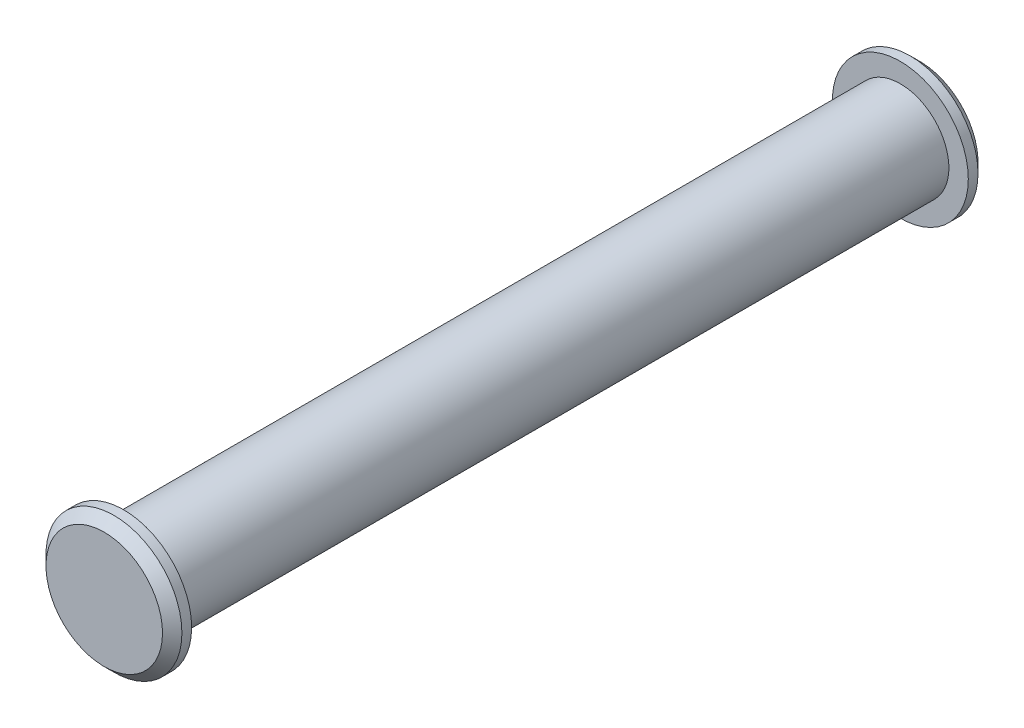
ISO-10303-21;
HEADER;
FILE_DESCRIPTION(('STEP AP214'),'2;1');
FILE_NAME('part.step','',(''),(''),'','','');
FILE_SCHEMA(('AUTOMOTIVE_DESIGN { 1 0 10303 214 1 1 1 1 }'));
ENDSEC;
DATA;
#1=APPLICATION_CONTEXT('core data for automotive mechanical design processes');
#2=APPLICATION_PROTOCOL_DEFINITION('international standard','automotive_design',2000,#1);
#3=PRODUCT_CONTEXT('',#1,'mechanical');
#4=PRODUCT('Part','Part','',(#3));
#5=PRODUCT_RELATED_PRODUCT_CATEGORY('part','',(#4));
#6=PRODUCT_DEFINITION_FORMATION('','',#4);
#7=PRODUCT_DEFINITION_CONTEXT('part definition',#1,'design');
#8=PRODUCT_DEFINITION('design','',#6,#7);
#9=PRODUCT_DEFINITION_SHAPE('','',#8);
#10=(LENGTH_UNIT() NAMED_UNIT(*) SI_UNIT(.MILLI.,.METRE.));
#11=(NAMED_UNIT(*) PLANE_ANGLE_UNIT() SI_UNIT($,.RADIAN.));
#12=(NAMED_UNIT(*) SI_UNIT($,.STERADIAN.) SOLID_ANGLE_UNIT());
#13=UNCERTAINTY_MEASURE_WITH_UNIT(LENGTH_MEASURE(1.E-05),#10,'distance_accuracy_value','');
#14=(GEOMETRIC_REPRESENTATION_CONTEXT(3) GLOBAL_UNCERTAINTY_ASSIGNED_CONTEXT((#13)) GLOBAL_UNIT_ASSIGNED_CONTEXT((#10,
#11,#12)) REPRESENTATION_CONTEXT('',''));
#15=CARTESIAN_POINT('',(0.,0.,0.));
#16=DIRECTION('',(0.,0.,1.));
#17=DIRECTION('',(1.,0.,0.));
#18=AXIS2_PLACEMENT_3D('',#15,#16,#17);
#19=CARTESIAN_POINT('',(0.,0.,20.));
#20=DIRECTION('',(0.,0.,-1.));
#21=DIRECTION('',(-1.,0.,0.));
#22=AXIS2_PLACEMENT_3D('',#19,#20,#21);
#23=CYLINDRICAL_SURFACE('',#22,2.5);
#24=CARTESIAN_POINT('',(0.,0.,20.));
#25=DIRECTION('',(0.,0.,1.));
#26=DIRECTION('',(1.,0.,0.));
#27=AXIS2_PLACEMENT_3D('',#24,#25,#26);
#28=CIRCLE('',#27,2.5);
#29=CARTESIAN_POINT('',(2.5,0.,20.));
#30=VERTEX_POINT('',#29);
#31=EDGE_CURVE('E53',#30,#30,#28,.T.);
#32=ORIENTED_EDGE('',*,*,#31,.F.);
#33=EDGE_LOOP('',(#32));
#34=FACE_BOUND('',#33,.T.);
#35=CARTESIAN_POINT('',(0.,0.,-20.));
#36=DIRECTION('',(0.,0.,-1.));
#37=DIRECTION('',(-1.,0.,0.));
#38=AXIS2_PLACEMENT_3D('',#35,#36,#37);
#39=CIRCLE('',#38,2.5);
#40=CARTESIAN_POINT('',(-2.5,0.,-20.));
#41=VERTEX_POINT('',#40);
#42=EDGE_CURVE('E59',#41,#41,#39,.T.);
#43=ORIENTED_EDGE('',*,*,#42,.F.);
#44=EDGE_LOOP('',(#43));
#45=FACE_BOUND('',#44,.T.);
#46=ADVANCED_FACE('F33',(#34,#45),#23,.T.);
#47=CARTESIAN_POINT('',(0.,0.,20.));
#48=DIRECTION('',(0.,0.,1.));
#49=DIRECTION('',(1.,0.,0.));
#50=AXIS2_PLACEMENT_3D('',#47,#48,#49);
#51=PLANE('',#50);
#52=CARTESIAN_POINT('',(0.,0.,20.));
#53=DIRECTION('',(0.,0.,1.));
#54=DIRECTION('',(1.,0.,0.));
#55=AXIS2_PLACEMENT_3D('',#52,#53,#54);
#56=CIRCLE('',#55,3.5);
#57=CARTESIAN_POINT('',(3.5,0.,20.));
#58=VERTEX_POINT('',#57);
#59=EDGE_CURVE('E56',#58,#58,#56,.T.);
#60=ORIENTED_EDGE('',*,*,#59,.F.);
#61=EDGE_LOOP('',(#60));
#62=FACE_BOUND('',#61,.T.);
#63=ORIENTED_EDGE('',*,*,#31,.T.);
#64=EDGE_LOOP('',(#63));
#65=FACE_BOUND('',#64,.T.);
#66=ADVANCED_FACE('F85',(#62,#65),#51,.F.);
#67=CARTESIAN_POINT('',(0.,0.,21.));
#68=DIRECTION('',(0.,0.,-1.));
#69=DIRECTION('',(-1.,0.,0.));
#70=AXIS2_PLACEMENT_3D('',#67,#68,#69);
#71=CYLINDRICAL_SURFACE('',#70,3.5);
#72=CARTESIAN_POINT('',(0.,0.,20.5));
#73=DIRECTION('',(0.,0.,1.));
#74=DIRECTION('',(1.,0.,0.));
#75=AXIS2_PLACEMENT_3D('',#72,#73,#74);
#76=CIRCLE('',#75,3.5);
#77=CARTESIAN_POINT('',(3.5,0.,20.5));
#78=VERTEX_POINT('',#77);
#79=EDGE_CURVE('E10',#78,#78,#76,.F.);
#80=ORIENTED_EDGE('',*,*,#79,.T.);
#81=EDGE_LOOP('',(#80));
#82=FACE_BOUND('',#81,.T.);
#83=ORIENTED_EDGE('',*,*,#59,.T.);
#84=EDGE_LOOP('',(#83));
#85=FACE_BOUND('',#84,.T.);
#86=ADVANCED_FACE('F91',(#82,#85),#71,.T.);
#87=CARTESIAN_POINT('',(0.,0.,21.));
#88=DIRECTION('',(0.,0.,1.));
#89=DIRECTION('',(1.,0.,0.));
#90=AXIS2_PLACEMENT_3D('',#87,#88,#89);
#91=PLANE('',#90);
#92=CARTESIAN_POINT('',(0.,0.,21.));
#93=DIRECTION('',(0.,0.,1.));
#94=DIRECTION('',(1.,0.,0.));
#95=AXIS2_PLACEMENT_3D('',#92,#93,#94);
#96=CIRCLE('',#95,2.99999999999999);
#97=CARTESIAN_POINT('',(2.99999999999999,0.,21.));
#98=VERTEX_POINT('',#97);
#99=EDGE_CURVE('E40',#98,#98,#96,.T.);
#100=ORIENTED_EDGE('',*,*,#99,.T.);
#101=EDGE_LOOP('',(#100));
#102=FACE_BOUND('',#101,.T.);
#103=ADVANCED_FACE('F81',(#102),#91,.T.);
#104=CARTESIAN_POINT('',(0.,0.,-20.));
#105=DIRECTION('',(0.,0.,-1.));
#106=DIRECTION('',(1.,0.,0.));
#107=AXIS2_PLACEMENT_3D('',#104,#105,#106);
#108=PLANE('',#107);
#109=CARTESIAN_POINT('',(0.,0.,-20.));
#110=DIRECTION('',(0.,0.,1.));
#111=DIRECTION('',(1.,0.,0.));
#112=AXIS2_PLACEMENT_3D('',#109,#110,#111);
#113=CIRCLE('',#112,3.5);
#114=CARTESIAN_POINT('',(3.5,0.,-20.));
#115=VERTEX_POINT('',#114);
#116=EDGE_CURVE('E62',#115,#115,#113,.T.);
#117=ORIENTED_EDGE('',*,*,#116,.T.);
#118=EDGE_LOOP('',(#117));
#119=FACE_BOUND('',#118,.T.);
#120=ORIENTED_EDGE('',*,*,#42,.T.);
#121=EDGE_LOOP('',(#120));
#122=FACE_BOUND('',#121,.T.);
#123=ADVANCED_FACE('F66',(#119,#122),#108,.F.);
#124=CARTESIAN_POINT('',(0.,0.,-21.));
#125=DIRECTION('',(0.,0.,1.));
#126=DIRECTION('',(1.,0.,0.));
#127=AXIS2_PLACEMENT_3D('',#124,#125,#126);
#128=CYLINDRICAL_SURFACE('',#127,3.5);
#129=CARTESIAN_POINT('',(0.,0.,-20.5));
#130=DIRECTION('',(0.,0.,-1.));
#131=DIRECTION('',(-1.,0.,0.));
#132=AXIS2_PLACEMENT_3D('',#129,#130,#131);
#133=CIRCLE('',#132,3.5);
#134=CARTESIAN_POINT('',(-3.5,0.,-20.5));
#135=VERTEX_POINT('',#134);
#136=EDGE_CURVE('E48',#135,#135,#133,.F.);
#137=ORIENTED_EDGE('',*,*,#136,.T.);
#138=EDGE_LOOP('',(#137));
#139=FACE_BOUND('',#138,.T.);
#140=ORIENTED_EDGE('',*,*,#116,.F.);
#141=EDGE_LOOP('',(#140));
#142=FACE_BOUND('',#141,.T.);
#143=ADVANCED_FACE('F69',(#139,#142),#128,.T.);
#144=CARTESIAN_POINT('',(0.,0.,-21.));
#145=DIRECTION('',(0.,0.,-1.));
#146=DIRECTION('',(1.,0.,0.));
#147=AXIS2_PLACEMENT_3D('',#144,#145,#146);
#148=PLANE('',#147);
#149=CARTESIAN_POINT('',(0.,0.,-21.));
#150=DIRECTION('',(0.,0.,-1.));
#151=DIRECTION('',(-1.,0.,0.));
#152=AXIS2_PLACEMENT_3D('',#149,#150,#151);
#153=CIRCLE('',#152,3.);
#154=CARTESIAN_POINT('',(-3.,0.,-21.));
#155=VERTEX_POINT('',#154);
#156=EDGE_CURVE('E44',#155,#155,#153,.T.);
#157=ORIENTED_EDGE('',*,*,#156,.T.);
#158=EDGE_LOOP('',(#157));
#159=FACE_BOUND('',#158,.T.);
#160=ADVANCED_FACE('F71',(#159),#148,.T.);
#161=CARTESIAN_POINT('',(0.,0.,-20.5));
#162=DIRECTION('',(0.,0.,1.));
#163=DIRECTION('',(1.,0.,0.));
#164=AXIS2_PLACEMENT_3D('',#161,#162,#163);
#165=CONICAL_SURFACE('',#164,3.5,0.785398163397452);
#166=ORIENTED_EDGE('',*,*,#156,.F.);
#167=EDGE_LOOP('',(#166));
#168=FACE_BOUND('',#167,.T.);
#169=ORIENTED_EDGE('',*,*,#136,.F.);
#170=EDGE_LOOP('',(#169));
#171=FACE_BOUND('',#170,.T.);
#172=ADVANCED_FACE('F78',(#168,#171),#165,.T.);
#173=CARTESIAN_POINT('',(0.,0.,21.));
#174=DIRECTION('',(0.,0.,-1.));
#175=DIRECTION('',(-1.,0.,0.));
#176=AXIS2_PLACEMENT_3D('',#173,#174,#175);
#177=CONICAL_SURFACE('',#176,2.99999999999999,0.785398163397445);
#178=ORIENTED_EDGE('',*,*,#79,.F.);
#179=EDGE_LOOP('',(#178));
#180=FACE_BOUND('',#179,.T.);
#181=ORIENTED_EDGE('',*,*,#99,.F.);
#182=EDGE_LOOP('',(#181));
#183=FACE_BOUND('',#182,.T.);
#184=ADVANCED_FACE('F35',(#180,#183),#177,.T.);
#185=CLOSED_SHELL('',(#46,#66,#86,#103,#123,#143,#160,#172,#184));
#186=MANIFOLD_SOLID_BREP('B2',#185);
#187=ADVANCED_BREP_SHAPE_REPRESENTATION('',(#18,#186),#14);
#188=SHAPE_DEFINITION_REPRESENTATION(#9,#187);
ENDSEC;
END-ISO-10303-21;
